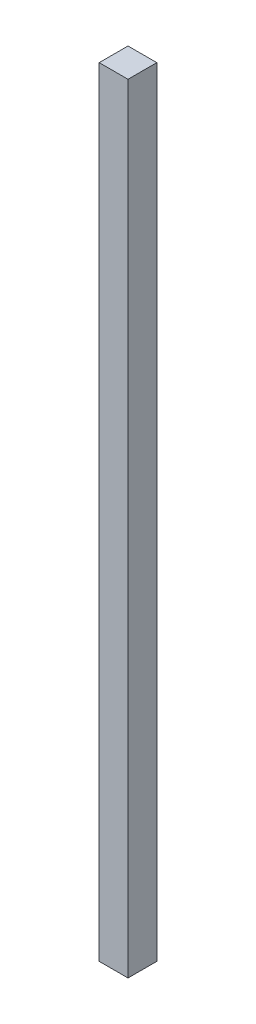
ISO-10303-21;
HEADER;
FILE_DESCRIPTION(('STEP AP214'),'2;1');
FILE_NAME('part.step','',(''),(''),'','','');
FILE_SCHEMA(('AUTOMOTIVE_DESIGN { 1 0 10303 214 1 1 1 1 }'));
ENDSEC;
DATA;
#1=APPLICATION_CONTEXT('core data for automotive mechanical design processes');
#2=APPLICATION_PROTOCOL_DEFINITION('international standard','automotive_design',2000,#1);
#3=PRODUCT_CONTEXT('',#1,'mechanical');
#4=PRODUCT('Part','Part','',(#3));
#5=PRODUCT_RELATED_PRODUCT_CATEGORY('part','',(#4));
#6=PRODUCT_DEFINITION_FORMATION('','',#4);
#7=PRODUCT_DEFINITION_CONTEXT('part definition',#1,'design');
#8=PRODUCT_DEFINITION('design','',#6,#7);
#9=PRODUCT_DEFINITION_SHAPE('','',#8);
#10=(LENGTH_UNIT() NAMED_UNIT(*) SI_UNIT(.MILLI.,.METRE.));
#11=(NAMED_UNIT(*) PLANE_ANGLE_UNIT() SI_UNIT($,.RADIAN.));
#12=(NAMED_UNIT(*) SI_UNIT($,.STERADIAN.) SOLID_ANGLE_UNIT());
#13=UNCERTAINTY_MEASURE_WITH_UNIT(LENGTH_MEASURE(1.E-05),#10,'distance_accuracy_value','');
#14=(GEOMETRIC_REPRESENTATION_CONTEXT(3) GLOBAL_UNCERTAINTY_ASSIGNED_CONTEXT((#13)) GLOBAL_UNIT_ASSIGNED_CONTEXT((#10,
#11,#12)) REPRESENTATION_CONTEXT('',''));
#15=CARTESIAN_POINT('',(0.,0.,0.));
#16=DIRECTION('',(0.,0.,1.));
#17=DIRECTION('',(1.,0.,0.));
#18=AXIS2_PLACEMENT_3D('',#15,#16,#17);
#19=CARTESIAN_POINT('',(44.45,2401.8875,44.45));
#20=DIRECTION('',(-1.,0.,0.));
#21=DIRECTION('',(0.,0.,1.));
#22=AXIS2_PLACEMENT_3D('',#19,#20,#21);
#23=PLANE('',#22);
#24=DIRECTION('',(0.,0.,-1.));
#25=VECTOR('',#24,1.);
#26=CARTESIAN_POINT('',(44.45,0.,44.45));
#27=LINE('',#26,#25);
#28=CARTESIAN_POINT('',(44.45,0.,44.45));
#29=VERTEX_POINT('',#28);
#30=CARTESIAN_POINT('',(44.45,0.,-44.45));
#31=VERTEX_POINT('',#30);
#32=EDGE_CURVE('E95',#29,#31,#27,.T.);
#33=ORIENTED_EDGE('',*,*,#32,.T.);
#34=DIRECTION('',(0.,-1.,0.));
#35=VECTOR('',#34,1.);
#36=CARTESIAN_POINT('',(44.45,2401.8875,-44.45));
#37=LINE('',#36,#35);
#38=CARTESIAN_POINT('',(44.45,2401.8875,-44.45));
#39=VERTEX_POINT('',#38);
#40=EDGE_CURVE('E11',#39,#31,#37,.T.);
#41=ORIENTED_EDGE('',*,*,#40,.F.);
#42=DIRECTION('',(0.,0.,-1.));
#43=VECTOR('',#42,1.);
#44=CARTESIAN_POINT('',(44.45,2401.8875,44.45));
#45=LINE('',#44,#43);
#46=CARTESIAN_POINT('',(44.45,2401.8875,44.45));
#47=VERTEX_POINT('',#46);
#48=EDGE_CURVE('E83',#47,#39,#45,.T.);
#49=ORIENTED_EDGE('',*,*,#48,.F.);
#50=DIRECTION('',(0.,-1.,0.));
#51=VECTOR('',#50,1.);
#52=CARTESIAN_POINT('',(44.45,2401.8875,44.45));
#53=LINE('',#52,#51);
#54=EDGE_CURVE('E91',#47,#29,#53,.T.);
#55=ORIENTED_EDGE('',*,*,#54,.T.);
#56=EDGE_LOOP('',(#33,#41,#49,#55));
#57=FACE_BOUND('',#56,.T.);
#58=ADVANCED_FACE('F32',(#57),#23,.F.);
#59=CARTESIAN_POINT('',(-44.45,2401.8875,-44.45));
#60=DIRECTION('',(0.,0.,1.));
#61=DIRECTION('',(1.,0.,0.));
#62=AXIS2_PLACEMENT_3D('',#59,#60,#61);
#63=PLANE('',#62);
#64=DIRECTION('',(-1.,0.,0.));
#65=VECTOR('',#64,1.);
#66=CARTESIAN_POINT('',(-44.45,0.,-44.45));
#67=LINE('',#66,#65);
#68=CARTESIAN_POINT('',(-44.45,0.,-44.45));
#69=VERTEX_POINT('',#68);
#70=EDGE_CURVE('E87',#31,#69,#67,.T.);
#71=ORIENTED_EDGE('',*,*,#70,.T.);
#72=DIRECTION('',(0.,-1.,0.));
#73=VECTOR('',#72,1.);
#74=CARTESIAN_POINT('',(-44.45,2401.8875,-44.45));
#75=LINE('',#74,#73);
#76=CARTESIAN_POINT('',(-44.45,2401.8875,-44.45));
#77=VERTEX_POINT('',#76);
#78=EDGE_CURVE('E40',#77,#69,#75,.T.);
#79=ORIENTED_EDGE('',*,*,#78,.F.);
#80=DIRECTION('',(-1.,0.,0.));
#81=VECTOR('',#80,1.);
#82=CARTESIAN_POINT('',(-44.45,2401.8875,-44.45));
#83=LINE('',#82,#81);
#84=EDGE_CURVE('E78',#39,#77,#83,.T.);
#85=ORIENTED_EDGE('',*,*,#84,.F.);
#86=ORIENTED_EDGE('',*,*,#40,.T.);
#87=EDGE_LOOP('',(#71,#79,#85,#86));
#88=FACE_BOUND('',#87,.T.);
#89=ADVANCED_FACE('F86',(#88),#63,.F.);
#90=CARTESIAN_POINT('',(-44.45,2401.8875,44.45));
#91=DIRECTION('',(1.,0.,0.));
#92=DIRECTION('',(0.,0.,-1.));
#93=AXIS2_PLACEMENT_3D('',#90,#91,#92);
#94=PLANE('',#93);
#95=DIRECTION('',(0.,0.,1.));
#96=VECTOR('',#95,1.);
#97=CARTESIAN_POINT('',(-44.45,0.,44.45));
#98=LINE('',#97,#96);
#99=CARTESIAN_POINT('',(-44.45,0.,44.45));
#100=VERTEX_POINT('',#99);
#101=EDGE_CURVE('E65',#69,#100,#98,.T.);
#102=ORIENTED_EDGE('',*,*,#101,.T.);
#103=DIRECTION('',(0.,-1.,0.));
#104=VECTOR('',#103,1.);
#105=CARTESIAN_POINT('',(-44.45,2401.8875,44.45));
#106=LINE('',#105,#104);
#107=CARTESIAN_POINT('',(-44.45,2401.8875,44.45));
#108=VERTEX_POINT('',#107);
#109=EDGE_CURVE('E88',#108,#100,#106,.T.);
#110=ORIENTED_EDGE('',*,*,#109,.F.);
#111=DIRECTION('',(0.,0.,1.));
#112=VECTOR('',#111,1.);
#113=CARTESIAN_POINT('',(-44.45,2401.8875,44.45));
#114=LINE('',#113,#112);
#115=EDGE_CURVE('E81',#77,#108,#114,.T.);
#116=ORIENTED_EDGE('',*,*,#115,.F.);
#117=ORIENTED_EDGE('',*,*,#78,.T.);
#118=EDGE_LOOP('',(#102,#110,#116,#117));
#119=FACE_BOUND('',#118,.T.);
#120=ADVANCED_FACE('F89',(#119),#94,.F.);
#121=CARTESIAN_POINT('',(-44.45,2401.8875,44.45));
#122=DIRECTION('',(0.,0.,-1.));
#123=DIRECTION('',(-1.,0.,0.));
#124=AXIS2_PLACEMENT_3D('',#121,#122,#123);
#125=PLANE('',#124);
#126=DIRECTION('',(1.,0.,0.));
#127=VECTOR('',#126,1.);
#128=CARTESIAN_POINT('',(-44.45,0.,44.45));
#129=LINE('',#128,#127);
#130=EDGE_CURVE('E71',#100,#29,#129,.T.);
#131=ORIENTED_EDGE('',*,*,#130,.T.);
#132=ORIENTED_EDGE('',*,*,#54,.F.);
#133=DIRECTION('',(1.,0.,0.));
#134=VECTOR('',#133,1.);
#135=CARTESIAN_POINT('',(-44.45,2401.8875,44.45));
#136=LINE('',#135,#134);
#137=EDGE_CURVE('E48',#108,#47,#136,.T.);
#138=ORIENTED_EDGE('',*,*,#137,.F.);
#139=ORIENTED_EDGE('',*,*,#109,.T.);
#140=EDGE_LOOP('',(#131,#132,#138,#139));
#141=FACE_BOUND('',#140,.T.);
#142=ADVANCED_FACE('F102',(#141),#125,.F.);
#143=CARTESIAN_POINT('',(0.,2401.8875,0.));
#144=DIRECTION('',(0.,-1.,0.));
#145=DIRECTION('',(0.,0.,-1.));
#146=AXIS2_PLACEMENT_3D('',#143,#144,#145);
#147=PLANE('',#146);
#148=ORIENTED_EDGE('',*,*,#48,.T.);
#149=ORIENTED_EDGE('',*,*,#84,.T.);
#150=ORIENTED_EDGE('',*,*,#115,.T.);
#151=ORIENTED_EDGE('',*,*,#137,.T.);
#152=EDGE_LOOP('',(#148,#149,#150,#151));
#153=FACE_BOUND('',#152,.T.);
#154=ADVANCED_FACE('F79',(#153),#147,.F.);
#155=CARTESIAN_POINT('',(0.,0.,0.));
#156=DIRECTION('',(0.,-1.,0.));
#157=DIRECTION('',(0.,0.,-1.));
#158=AXIS2_PLACEMENT_3D('',#155,#156,#157);
#159=PLANE('',#158);
#160=ORIENTED_EDGE('',*,*,#32,.F.);
#161=ORIENTED_EDGE('',*,*,#130,.F.);
#162=ORIENTED_EDGE('',*,*,#101,.F.);
#163=ORIENTED_EDGE('',*,*,#70,.F.);
#164=EDGE_LOOP('',(#160,#161,#162,#163));
#165=FACE_BOUND('',#164,.T.);
#166=ADVANCED_FACE('F105',(#165),#159,.T.);
#167=CLOSED_SHELL('',(#58,#89,#120,#142,#154,#166));
#168=MANIFOLD_SOLID_BREP('B2',#167);
#169=ADVANCED_BREP_SHAPE_REPRESENTATION('',(#18,#168),#14);
#170=SHAPE_DEFINITION_REPRESENTATION(#9,#169);
ENDSEC;
END-ISO-10303-21;
